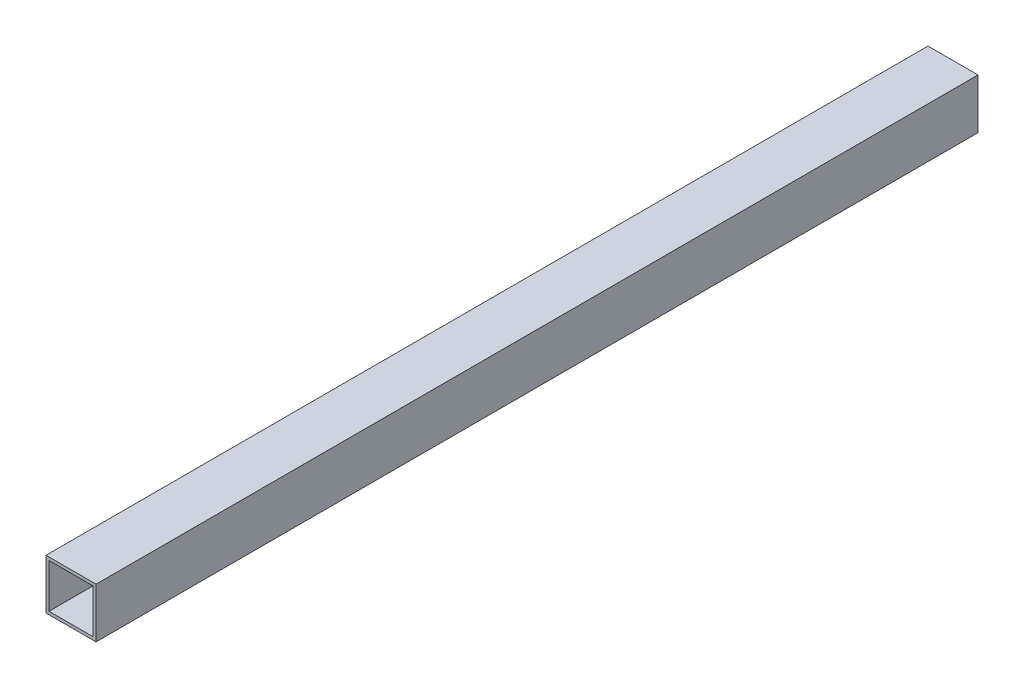
ISO-10303-21;
HEADER;
FILE_DESCRIPTION(('STEP AP214'),'2;1');
FILE_NAME('part.step','',(''),(''),'','','');
FILE_SCHEMA(('AUTOMOTIVE_DESIGN { 1 0 10303 214 1 1 1 1 }'));
ENDSEC;
DATA;
#1=APPLICATION_CONTEXT('core data for automotive mechanical design processes');
#2=APPLICATION_PROTOCOL_DEFINITION('international standard','automotive_design',2000,#1);
#3=PRODUCT_CONTEXT('',#1,'mechanical');
#4=PRODUCT('Part','Part','',(#3));
#5=PRODUCT_RELATED_PRODUCT_CATEGORY('part','',(#4));
#6=PRODUCT_DEFINITION_FORMATION('','',#4);
#7=PRODUCT_DEFINITION_CONTEXT('part definition',#1,'design');
#8=PRODUCT_DEFINITION('design','',#6,#7);
#9=PRODUCT_DEFINITION_SHAPE('','',#8);
#10=(LENGTH_UNIT() NAMED_UNIT(*) SI_UNIT(.MILLI.,.METRE.));
#11=(NAMED_UNIT(*) PLANE_ANGLE_UNIT() SI_UNIT($,.RADIAN.));
#12=(NAMED_UNIT(*) SI_UNIT($,.STERADIAN.) SOLID_ANGLE_UNIT());
#13=UNCERTAINTY_MEASURE_WITH_UNIT(LENGTH_MEASURE(1.E-05),#10,'distance_accuracy_value','');
#14=(GEOMETRIC_REPRESENTATION_CONTEXT(3) GLOBAL_UNCERTAINTY_ASSIGNED_CONTEXT((#13)) GLOBAL_UNIT_ASSIGNED_CONTEXT((#10,
#11,#12)) REPRESENTATION_CONTEXT('',''));
#15=CARTESIAN_POINT('',(0.,0.,0.));
#16=DIRECTION('',(0.,0.,1.));
#17=DIRECTION('',(1.,0.,0.));
#18=AXIS2_PLACEMENT_3D('',#15,#16,#17);
#19=CARTESIAN_POINT('',(0.,0.,447.675));
#20=DIRECTION('',(0.,0.,1.));
#21=DIRECTION('',(1.,0.,0.));
#22=AXIS2_PLACEMENT_3D('',#19,#20,#21);
#23=PLANE('',#22);
#24=DIRECTION('',(0.,1.,0.));
#25=VECTOR('',#24,1.);
#26=CARTESIAN_POINT('',(0.,0.,447.675));
#27=LINE('',#26,#25);
#28=CARTESIAN_POINT('',(0.,0.,447.675));
#29=VERTEX_POINT('',#28);
#30=CARTESIAN_POINT('',(0.,25.4,447.675));
#31=VERTEX_POINT('',#30);
#32=EDGE_CURVE('E162',#29,#31,#27,.T.);
#33=ORIENTED_EDGE('',*,*,#32,.T.);
#34=DIRECTION('',(-1.,0.,0.));
#35=VECTOR('',#34,1.);
#36=CARTESIAN_POINT('',(0.,25.4,447.675));
#37=LINE('',#36,#35);
#38=CARTESIAN_POINT('',(-25.4,25.4,447.675));
#39=VERTEX_POINT('',#38);
#40=EDGE_CURVE('E165',#31,#39,#37,.T.);
#41=ORIENTED_EDGE('',*,*,#40,.T.);
#42=DIRECTION('',(0.,-1.,0.));
#43=VECTOR('',#42,1.);
#44=CARTESIAN_POINT('',(-25.4,0.,447.675));
#45=LINE('',#44,#43);
#46=CARTESIAN_POINT('',(-25.4,0.,447.675));
#47=VERTEX_POINT('',#46);
#48=EDGE_CURVE('E168',#39,#47,#45,.T.);
#49=ORIENTED_EDGE('',*,*,#48,.T.);
#50=DIRECTION('',(1.,0.,0.));
#51=VECTOR('',#50,1.);
#52=CARTESIAN_POINT('',(0.,0.,447.675));
#53=LINE('',#52,#51);
#54=EDGE_CURVE('E170',#47,#29,#53,.T.);
#55=ORIENTED_EDGE('',*,*,#54,.T.);
#56=EDGE_LOOP('',(#33,#41,#49,#55));
#57=FACE_BOUND('',#56,.T.);
#58=DIRECTION('',(-1.,0.,0.));
#59=VECTOR('',#58,1.);
#60=CARTESIAN_POINT('',(0.,23.876,447.675));
#61=LINE('',#60,#59);
#62=CARTESIAN_POINT('',(-1.524,23.876,447.675));
#63=VERTEX_POINT('',#62);
#64=CARTESIAN_POINT('',(-23.876,23.876,447.675));
#65=VERTEX_POINT('',#64);
#66=EDGE_CURVE('E134',#63,#65,#61,.T.);
#67=ORIENTED_EDGE('',*,*,#66,.F.);
#68=DIRECTION('',(0.,1.,0.));
#69=VECTOR('',#68,1.);
#70=CARTESIAN_POINT('',(-1.524,0.,447.675));
#71=LINE('',#70,#69);
#72=CARTESIAN_POINT('',(-1.524,1.524,447.675));
#73=VERTEX_POINT('',#72);
#74=EDGE_CURVE('E126',#73,#63,#71,.T.);
#75=ORIENTED_EDGE('',*,*,#74,.F.);
#76=DIRECTION('',(1.,0.,0.));
#77=VECTOR('',#76,1.);
#78=CARTESIAN_POINT('',(0.,1.524,447.675));
#79=LINE('',#78,#77);
#80=CARTESIAN_POINT('',(-23.876,1.524,447.675));
#81=VERTEX_POINT('',#80);
#82=EDGE_CURVE('E148',#81,#73,#79,.T.);
#83=ORIENTED_EDGE('',*,*,#82,.F.);
#84=DIRECTION('',(0.,-1.,0.));
#85=VECTOR('',#84,1.);
#86=CARTESIAN_POINT('',(-23.876,0.,447.675));
#87=LINE('',#86,#85);
#88=EDGE_CURVE('E146',#65,#81,#87,.T.);
#89=ORIENTED_EDGE('',*,*,#88,.F.);
#90=EDGE_LOOP('',(#67,#75,#83,#89));
#91=FACE_BOUND('',#90,.T.);
#92=ADVANCED_FACE('F61',(#57,#91),#23,.T.);
#93=CARTESIAN_POINT('',(0.,0.,0.));
#94=DIRECTION('',(0.,0.,1.));
#95=DIRECTION('',(1.,0.,0.));
#96=AXIS2_PLACEMENT_3D('',#93,#94,#95);
#97=PLANE('',#96);
#98=DIRECTION('',(0.,1.,0.));
#99=VECTOR('',#98,1.);
#100=CARTESIAN_POINT('',(0.,0.,0.));
#101=LINE('',#100,#99);
#102=CARTESIAN_POINT('',(0.,0.,0.));
#103=VERTEX_POINT('',#102);
#104=CARTESIAN_POINT('',(0.,25.4,0.));
#105=VERTEX_POINT('',#104);
#106=EDGE_CURVE('E142',#103,#105,#101,.T.);
#107=ORIENTED_EDGE('',*,*,#106,.F.);
#108=DIRECTION('',(1.,0.,0.));
#109=VECTOR('',#108,1.);
#110=CARTESIAN_POINT('',(0.,0.,0.));
#111=LINE('',#110,#109);
#112=CARTESIAN_POINT('',(-25.4,0.,0.));
#113=VERTEX_POINT('',#112);
#114=EDGE_CURVE('E166',#113,#103,#111,.T.);
#115=ORIENTED_EDGE('',*,*,#114,.F.);
#116=DIRECTION('',(0.,-1.,0.));
#117=VECTOR('',#116,1.);
#118=CARTESIAN_POINT('',(-25.4,0.,0.));
#119=LINE('',#118,#117);
#120=CARTESIAN_POINT('',(-25.4,25.4,0.));
#121=VERTEX_POINT('',#120);
#122=EDGE_CURVE('E177',#121,#113,#119,.T.);
#123=ORIENTED_EDGE('',*,*,#122,.F.);
#124=DIRECTION('',(-1.,0.,0.));
#125=VECTOR('',#124,1.);
#126=CARTESIAN_POINT('',(0.,25.4,0.));
#127=LINE('',#126,#125);
#128=EDGE_CURVE('E175',#105,#121,#127,.T.);
#129=ORIENTED_EDGE('',*,*,#128,.F.);
#130=EDGE_LOOP('',(#107,#115,#123,#129));
#131=FACE_BOUND('',#130,.T.);
#132=DIRECTION('',(0.,1.,0.));
#133=VECTOR('',#132,1.);
#134=CARTESIAN_POINT('',(-1.524,0.,0.));
#135=LINE('',#134,#133);
#136=CARTESIAN_POINT('',(-1.524,1.524,0.));
#137=VERTEX_POINT('',#136);
#138=CARTESIAN_POINT('',(-1.524,23.876,0.));
#139=VERTEX_POINT('',#138);
#140=EDGE_CURVE('E84',#137,#139,#135,.T.);
#141=ORIENTED_EDGE('',*,*,#140,.T.);
#142=DIRECTION('',(-1.,0.,0.));
#143=VECTOR('',#142,1.);
#144=CARTESIAN_POINT('',(0.,23.876,0.));
#145=LINE('',#144,#143);
#146=CARTESIAN_POINT('',(-23.876,23.876,0.));
#147=VERTEX_POINT('',#146);
#148=EDGE_CURVE('E141',#139,#147,#145,.T.);
#149=ORIENTED_EDGE('',*,*,#148,.T.);
#150=DIRECTION('',(0.,-1.,0.));
#151=VECTOR('',#150,1.);
#152=CARTESIAN_POINT('',(-23.876,0.,0.));
#153=LINE('',#152,#151);
#154=CARTESIAN_POINT('',(-23.876,1.524,0.));
#155=VERTEX_POINT('',#154);
#156=EDGE_CURVE('E154',#147,#155,#153,.T.);
#157=ORIENTED_EDGE('',*,*,#156,.T.);
#158=DIRECTION('',(1.,0.,0.));
#159=VECTOR('',#158,1.);
#160=CARTESIAN_POINT('',(0.,1.524,0.));
#161=LINE('',#160,#159);
#162=EDGE_CURVE('E135',#155,#137,#161,.T.);
#163=ORIENTED_EDGE('',*,*,#162,.T.);
#164=EDGE_LOOP('',(#141,#149,#157,#163));
#165=FACE_BOUND('',#164,.T.);
#166=ADVANCED_FACE('F195',(#131,#165),#97,.F.);
#167=CARTESIAN_POINT('',(0.,0.,447.675));
#168=DIRECTION('',(-1.,0.,0.));
#169=DIRECTION('',(0.,0.,1.));
#170=AXIS2_PLACEMENT_3D('',#167,#168,#169);
#171=PLANE('',#170);
#172=ORIENTED_EDGE('',*,*,#106,.T.);
#173=DIRECTION('',(0.,0.,-1.));
#174=VECTOR('',#173,1.);
#175=CARTESIAN_POINT('',(0.,25.4,447.675));
#176=LINE('',#175,#174);
#177=EDGE_CURVE('E12',#31,#105,#176,.T.);
#178=ORIENTED_EDGE('',*,*,#177,.F.);
#179=ORIENTED_EDGE('',*,*,#32,.F.);
#180=DIRECTION('',(0.,0.,-1.));
#181=VECTOR('',#180,1.);
#182=CARTESIAN_POINT('',(0.,0.,447.675));
#183=LINE('',#182,#181);
#184=EDGE_CURVE('E172',#29,#103,#183,.T.);
#185=ORIENTED_EDGE('',*,*,#184,.T.);
#186=EDGE_LOOP('',(#172,#178,#179,#185));
#187=FACE_BOUND('',#186,.T.);
#188=ADVANCED_FACE('F63',(#187),#171,.F.);
#189=CARTESIAN_POINT('',(0.,25.4,447.675));
#190=DIRECTION('',(0.,-1.,0.));
#191=DIRECTION('',(1.,0.,0.));
#192=AXIS2_PLACEMENT_3D('',#189,#190,#191);
#193=PLANE('',#192);
#194=ORIENTED_EDGE('',*,*,#128,.T.);
#195=DIRECTION('',(0.,0.,-1.));
#196=VECTOR('',#195,1.);
#197=CARTESIAN_POINT('',(-25.4,25.4,447.675));
#198=LINE('',#197,#196);
#199=EDGE_CURVE('E69',#39,#121,#198,.T.);
#200=ORIENTED_EDGE('',*,*,#199,.F.);
#201=ORIENTED_EDGE('',*,*,#40,.F.);
#202=ORIENTED_EDGE('',*,*,#177,.T.);
#203=EDGE_LOOP('',(#194,#200,#201,#202));
#204=FACE_BOUND('',#203,.T.);
#205=ADVANCED_FACE('F205',(#204),#193,.F.);
#206=CARTESIAN_POINT('',(-25.4,0.,447.675));
#207=DIRECTION('',(1.,0.,0.));
#208=DIRECTION('',(0.,0.,-1.));
#209=AXIS2_PLACEMENT_3D('',#206,#207,#208);
#210=PLANE('',#209);
#211=ORIENTED_EDGE('',*,*,#122,.T.);
#212=DIRECTION('',(0.,0.,-1.));
#213=VECTOR('',#212,1.);
#214=CARTESIAN_POINT('',(-25.4,0.,447.675));
#215=LINE('',#214,#213);
#216=EDGE_CURVE('E182',#47,#113,#215,.T.);
#217=ORIENTED_EDGE('',*,*,#216,.F.);
#218=ORIENTED_EDGE('',*,*,#48,.F.);
#219=ORIENTED_EDGE('',*,*,#199,.T.);
#220=EDGE_LOOP('',(#211,#217,#218,#219));
#221=FACE_BOUND('',#220,.T.);
#222=ADVANCED_FACE('F189',(#221),#210,.F.);
#223=CARTESIAN_POINT('',(0.,0.,447.675));
#224=DIRECTION('',(0.,1.,0.));
#225=DIRECTION('',(-1.,0.,0.));
#226=AXIS2_PLACEMENT_3D('',#223,#224,#225);
#227=PLANE('',#226);
#228=ORIENTED_EDGE('',*,*,#114,.T.);
#229=ORIENTED_EDGE('',*,*,#184,.F.);
#230=ORIENTED_EDGE('',*,*,#54,.F.);
#231=ORIENTED_EDGE('',*,*,#216,.T.);
#232=EDGE_LOOP('',(#228,#229,#230,#231));
#233=FACE_BOUND('',#232,.T.);
#234=ADVANCED_FACE('F199',(#233),#227,.F.);
#235=CARTESIAN_POINT('',(-1.524,0.,447.675));
#236=DIRECTION('',(-1.,0.,0.));
#237=DIRECTION('',(0.,0.,1.));
#238=AXIS2_PLACEMENT_3D('',#235,#236,#237);
#239=PLANE('',#238);
#240=ORIENTED_EDGE('',*,*,#140,.F.);
#241=DIRECTION('',(0.,0.,-1.));
#242=VECTOR('',#241,1.);
#243=CARTESIAN_POINT('',(-1.524,1.524,447.675));
#244=LINE('',#243,#242);
#245=EDGE_CURVE('E130',#73,#137,#244,.T.);
#246=ORIENTED_EDGE('',*,*,#245,.F.);
#247=ORIENTED_EDGE('',*,*,#74,.T.);
#248=DIRECTION('',(0.,0.,-1.));
#249=VECTOR('',#248,1.);
#250=CARTESIAN_POINT('',(-1.524,23.876,447.675));
#251=LINE('',#250,#249);
#252=EDGE_CURVE('E129',#63,#139,#251,.T.);
#253=ORIENTED_EDGE('',*,*,#252,.T.);
#254=EDGE_LOOP('',(#240,#246,#247,#253));
#255=FACE_BOUND('',#254,.T.);
#256=ADVANCED_FACE('F128',(#255),#239,.T.);
#257=CARTESIAN_POINT('',(0.,23.876,447.675));
#258=DIRECTION('',(0.,-1.,0.));
#259=DIRECTION('',(1.,0.,0.));
#260=AXIS2_PLACEMENT_3D('',#257,#258,#259);
#261=PLANE('',#260);
#262=ORIENTED_EDGE('',*,*,#148,.F.);
#263=ORIENTED_EDGE('',*,*,#252,.F.);
#264=ORIENTED_EDGE('',*,*,#66,.T.);
#265=DIRECTION('',(0.,0.,-1.));
#266=VECTOR('',#265,1.);
#267=CARTESIAN_POINT('',(-23.876,23.876,447.675));
#268=LINE('',#267,#266);
#269=EDGE_CURVE('E143',#65,#147,#268,.T.);
#270=ORIENTED_EDGE('',*,*,#269,.T.);
#271=EDGE_LOOP('',(#262,#263,#264,#270));
#272=FACE_BOUND('',#271,.T.);
#273=ADVANCED_FACE('F138',(#272),#261,.T.);
#274=CARTESIAN_POINT('',(-23.876,0.,447.675));
#275=DIRECTION('',(1.,0.,0.));
#276=DIRECTION('',(0.,0.,-1.));
#277=AXIS2_PLACEMENT_3D('',#274,#275,#276);
#278=PLANE('',#277);
#279=ORIENTED_EDGE('',*,*,#156,.F.);
#280=ORIENTED_EDGE('',*,*,#269,.F.);
#281=ORIENTED_EDGE('',*,*,#88,.T.);
#282=DIRECTION('',(0.,0.,-1.));
#283=VECTOR('',#282,1.);
#284=CARTESIAN_POINT('',(-23.876,1.524,447.675));
#285=LINE('',#284,#283);
#286=EDGE_CURVE('E76',#81,#155,#285,.T.);
#287=ORIENTED_EDGE('',*,*,#286,.T.);
#288=EDGE_LOOP('',(#279,#280,#281,#287));
#289=FACE_BOUND('',#288,.T.);
#290=ADVANCED_FACE('F228',(#289),#278,.T.);
#291=CARTESIAN_POINT('',(0.,1.524,447.675));
#292=DIRECTION('',(0.,1.,0.));
#293=DIRECTION('',(-1.,0.,0.));
#294=AXIS2_PLACEMENT_3D('',#291,#292,#293);
#295=PLANE('',#294);
#296=ORIENTED_EDGE('',*,*,#162,.F.);
#297=ORIENTED_EDGE('',*,*,#286,.F.);
#298=ORIENTED_EDGE('',*,*,#82,.T.);
#299=ORIENTED_EDGE('',*,*,#245,.T.);
#300=EDGE_LOOP('',(#296,#297,#298,#299));
#301=FACE_BOUND('',#300,.T.);
#302=ADVANCED_FACE('F232',(#301),#295,.T.);
#303=CLOSED_SHELL('',(#92,#166,#188,#205,#222,#234,#256,#273,#290,#302));
#304=MANIFOLD_SOLID_BREP('B2',#303);
#305=ADVANCED_BREP_SHAPE_REPRESENTATION('',(#18,#304),#14);
#306=SHAPE_DEFINITION_REPRESENTATION(#9,#305);
ENDSEC;
END-ISO-10303-21;
